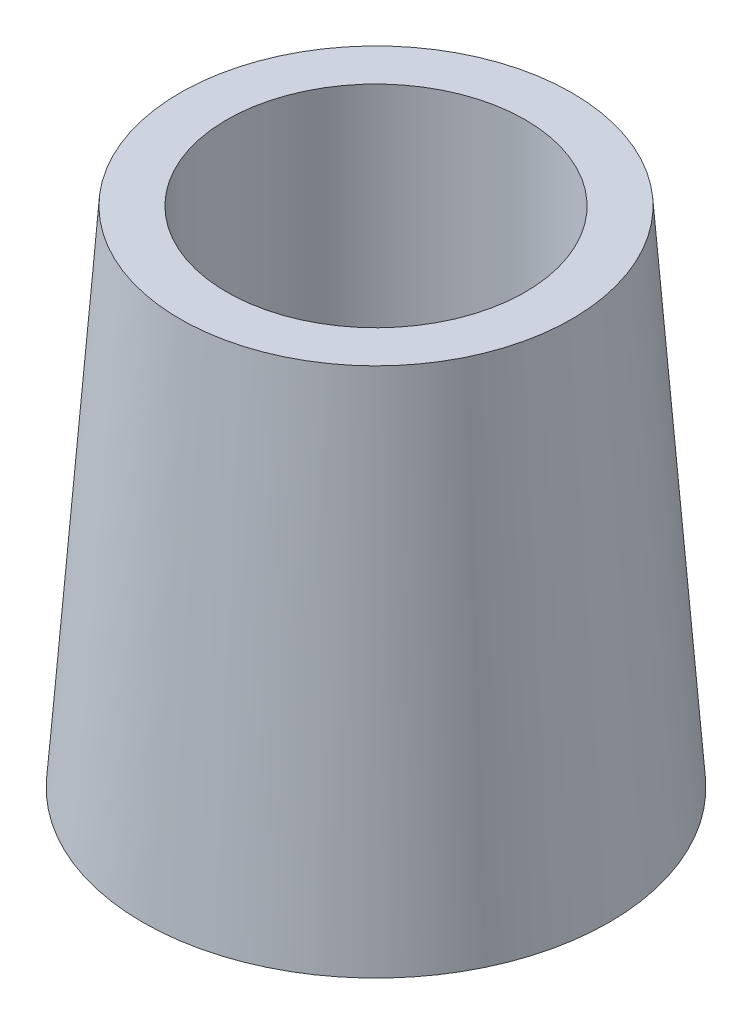
ISO-10303-21;
HEADER;
FILE_DESCRIPTION(('STEP AP214'),'2;1');
FILE_NAME('part.step','',(''),(''),'','','');
FILE_SCHEMA(('AUTOMOTIVE_DESIGN { 1 0 10303 214 1 1 1 1 }'));
ENDSEC;
DATA;
#1=APPLICATION_CONTEXT('core data for automotive mechanical design processes');
#2=APPLICATION_PROTOCOL_DEFINITION('international standard','automotive_design',2000,#1);
#3=PRODUCT_CONTEXT('',#1,'mechanical');
#4=PRODUCT('Part','Part','',(#3));
#5=PRODUCT_RELATED_PRODUCT_CATEGORY('part','',(#4));
#6=PRODUCT_DEFINITION_FORMATION('','',#4);
#7=PRODUCT_DEFINITION_CONTEXT('part definition',#1,'design');
#8=PRODUCT_DEFINITION('design','',#6,#7);
#9=PRODUCT_DEFINITION_SHAPE('','',#8);
#10=(LENGTH_UNIT() NAMED_UNIT(*) SI_UNIT(.MILLI.,.METRE.));
#11=(NAMED_UNIT(*) PLANE_ANGLE_UNIT() SI_UNIT($,.RADIAN.));
#12=(NAMED_UNIT(*) SI_UNIT($,.STERADIAN.) SOLID_ANGLE_UNIT());
#13=UNCERTAINTY_MEASURE_WITH_UNIT(LENGTH_MEASURE(1.E-05),#10,'distance_accuracy_value','');
#14=(GEOMETRIC_REPRESENTATION_CONTEXT(3) GLOBAL_UNCERTAINTY_ASSIGNED_CONTEXT((#13)) GLOBAL_UNIT_ASSIGNED_CONTEXT((#10,
#11,#12)) REPRESENTATION_CONTEXT('',''));
#15=CARTESIAN_POINT('',(0.,0.,0.));
#16=DIRECTION('',(0.,0.,1.));
#17=DIRECTION('',(1.,0.,0.));
#18=AXIS2_PLACEMENT_3D('',#15,#16,#17);
#19=CARTESIAN_POINT('',(8.,27.,0.));
#20=DIRECTION('',(0.,1.,0.));
#21=DIRECTION('',(0.,0.,1.));
#22=AXIS2_PLACEMENT_3D('',#19,#20,#21);
#23=PLANE('',#22);
#24=CARTESIAN_POINT('',(0.,27.,0.));
#25=DIRECTION('',(0.,-1.,0.));
#26=DIRECTION('',(0.,0.,-1.));
#27=AXIS2_PLACEMENT_3D('',#24,#25,#26);
#28=CIRCLE('',#27,8.);
#29=CARTESIAN_POINT('',(0.,27.,-8.));
#30=VERTEX_POINT('',#29);
#31=EDGE_CURVE('E10',#30,#30,#28,.T.);
#32=ORIENTED_EDGE('',*,*,#31,.T.);
#33=EDGE_LOOP('',(#32));
#34=FACE_BOUND('',#33,.T.);
#35=CARTESIAN_POINT('',(0.,27.,0.));
#36=DIRECTION('',(0.,-1.,0.));
#37=DIRECTION('',(0.,0.,-1.));
#38=AXIS2_PLACEMENT_3D('',#35,#36,#37);
#39=CIRCLE('',#38,10.5);
#40=CARTESIAN_POINT('',(0.,27.,-10.5));
#41=VERTEX_POINT('',#40);
#42=EDGE_CURVE('E60',#41,#41,#39,.T.);
#43=ORIENTED_EDGE('',*,*,#42,.F.);
#44=EDGE_LOOP('',(#43));
#45=FACE_BOUND('',#44,.T.);
#46=ADVANCED_FACE('F43',(#34,#45),#23,.T.);
#47=CARTESIAN_POINT('',(0.,0.,0.));
#48=DIRECTION('',(0.,-1.,0.));
#49=DIRECTION('',(0.,0.,-1.));
#50=AXIS2_PLACEMENT_3D('',#47,#48,#49);
#51=CYLINDRICAL_SURFACE('',#50,8.);
#52=CARTESIAN_POINT('',(0.,0.,0.));
#53=DIRECTION('',(0.,-1.,0.));
#54=DIRECTION('',(0.,0.,-1.));
#55=AXIS2_PLACEMENT_3D('',#52,#53,#54);
#56=CIRCLE('',#55,8.);
#57=CARTESIAN_POINT('',(0.,0.,-8.));
#58=VERTEX_POINT('',#57);
#59=EDGE_CURVE('E50',#58,#58,#56,.T.);
#60=ORIENTED_EDGE('',*,*,#59,.T.);
#61=EDGE_LOOP('',(#60));
#62=FACE_BOUND('',#61,.T.);
#63=ORIENTED_EDGE('',*,*,#31,.F.);
#64=EDGE_LOOP('',(#63));
#65=FACE_BOUND('',#64,.T.);
#66=ADVANCED_FACE('F71',(#62,#65),#51,.F.);
#67=CARTESIAN_POINT('',(12.5,0.,0.));
#68=DIRECTION('',(0.,-1.,0.));
#69=DIRECTION('',(0.,0.,-1.));
#70=AXIS2_PLACEMENT_3D('',#67,#68,#69);
#71=PLANE('',#70);
#72=CARTESIAN_POINT('',(0.,0.,0.));
#73=DIRECTION('',(0.,-1.,0.));
#74=DIRECTION('',(0.,0.,-1.));
#75=AXIS2_PLACEMENT_3D('',#72,#73,#74);
#76=CIRCLE('',#75,12.5);
#77=CARTESIAN_POINT('',(0.,0.,-12.5));
#78=VERTEX_POINT('',#77);
#79=EDGE_CURVE('E55',#78,#78,#76,.T.);
#80=ORIENTED_EDGE('',*,*,#79,.T.);
#81=EDGE_LOOP('',(#80));
#82=FACE_BOUND('',#81,.T.);
#83=ORIENTED_EDGE('',*,*,#59,.F.);
#84=EDGE_LOOP('',(#83));
#85=FACE_BOUND('',#84,.T.);
#86=ADVANCED_FACE('F75',(#82,#85),#71,.T.);
#87=CARTESIAN_POINT('',(0.,0.,0.));
#88=DIRECTION('',(0.,-1.,0.));
#89=DIRECTION('',(0.,0.,-1.));
#90=AXIS2_PLACEMENT_3D('',#87,#88,#89);
#91=CONICAL_SURFACE('',#90,12.5,0.0739390376579403);
#92=ORIENTED_EDGE('',*,*,#42,.T.);
#93=EDGE_LOOP('',(#92));
#94=FACE_BOUND('',#93,.T.);
#95=ORIENTED_EDGE('',*,*,#79,.F.);
#96=EDGE_LOOP('',(#95));
#97=FACE_BOUND('',#96,.T.);
#98=ADVANCED_FACE('F67',(#94,#97),#91,.T.);
#99=CLOSED_SHELL('',(#46,#66,#86,#98));
#100=MANIFOLD_SOLID_BREP('B2',#99);
#101=ADVANCED_BREP_SHAPE_REPRESENTATION('',(#18,#100),#14);
#102=SHAPE_DEFINITION_REPRESENTATION(#9,#101);
ENDSEC;
END-ISO-10303-21;
